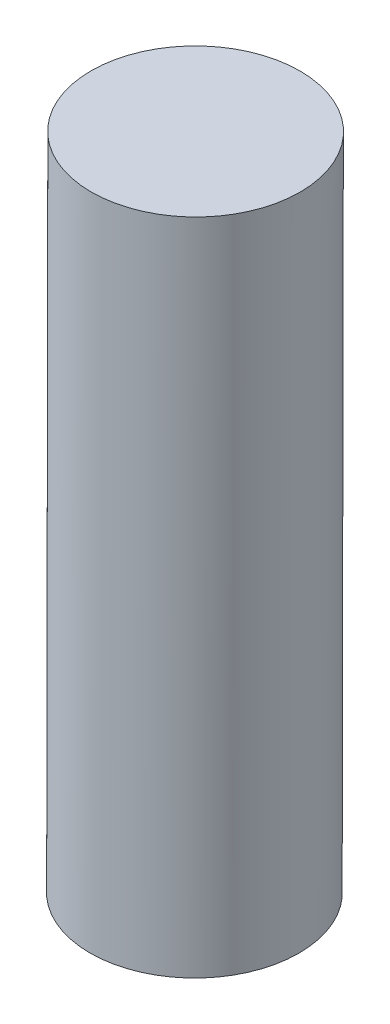
ISO-10303-21;
HEADER;
FILE_DESCRIPTION(('STEP AP214'),'2;1');
FILE_NAME('part.step','',(''),(''),'','','');
FILE_SCHEMA(('AUTOMOTIVE_DESIGN { 1 0 10303 214 1 1 1 1 }'));
ENDSEC;
DATA;
#1=APPLICATION_CONTEXT('core data for automotive mechanical design processes');
#2=APPLICATION_PROTOCOL_DEFINITION('international standard','automotive_design',2000,#1);
#3=PRODUCT_CONTEXT('',#1,'mechanical');
#4=PRODUCT('Part','Part','',(#3));
#5=PRODUCT_RELATED_PRODUCT_CATEGORY('part','',(#4));
#6=PRODUCT_DEFINITION_FORMATION('','',#4);
#7=PRODUCT_DEFINITION_CONTEXT('part definition',#1,'design');
#8=PRODUCT_DEFINITION('design','',#6,#7);
#9=PRODUCT_DEFINITION_SHAPE('','',#8);
#10=(LENGTH_UNIT() NAMED_UNIT(*) SI_UNIT(.MILLI.,.METRE.));
#11=(NAMED_UNIT(*) PLANE_ANGLE_UNIT() SI_UNIT($,.RADIAN.));
#12=(NAMED_UNIT(*) SI_UNIT($,.STERADIAN.) SOLID_ANGLE_UNIT());
#13=UNCERTAINTY_MEASURE_WITH_UNIT(LENGTH_MEASURE(1.E-05),#10,'distance_accuracy_value','');
#14=(GEOMETRIC_REPRESENTATION_CONTEXT(3) GLOBAL_UNCERTAINTY_ASSIGNED_CONTEXT((#13)) GLOBAL_UNIT_ASSIGNED_CONTEXT((#10,
#11,#12)) REPRESENTATION_CONTEXT('',''));
#15=CARTESIAN_POINT('',(0.,0.,0.));
#16=DIRECTION('',(0.,0.,1.));
#17=DIRECTION('',(1.,0.,0.));
#18=AXIS2_PLACEMENT_3D('',#15,#16,#17);
#19=CARTESIAN_POINT('',(-266.61706433789,133.219904817138,163.321796792769));
#20=DIRECTION('',(0.00176421332219243,0.999998443774466,1.17136488108813E-09));
#21=DIRECTION('',(-0.999998443774466,0.00176421332219243,0.));
#22=AXIS2_PLACEMENT_3D('',#19,#20,#21);
#23=PLANE('',#22);
#24=CARTESIAN_POINT('',(-266.61706433789,133.219904817138,163.321796792769));
#25=DIRECTION('',(0.00176421332219243,0.999998443774466,1.17136488108813E-09));
#26=DIRECTION('',(-0.999998443774466,0.00176421332219243,0.));
#27=AXIS2_PLACEMENT_3D('',#24,#25,#26);
#28=CIRCLE('',#27,4.69900000000002);
#29=CARTESIAN_POINT('',(-271.316057025187,133.228194855539,163.321796792769));
#30=VERTEX_POINT('',#29);
#31=EDGE_CURVE('E46',#30,#30,#28,.T.);
#32=ORIENTED_EDGE('',*,*,#31,.F.);
#33=EDGE_LOOP('',(#32));
#34=FACE_BOUND('',#33,.T.);
#35=ADVANCED_FACE('F40',(#34),#23,.F.);
#36=CARTESIAN_POINT('',(-266.564789525206,162.850522994416,163.321796827478));
#37=DIRECTION('',(0.00176421332219243,0.999998443774466,1.17136488108813E-09));
#38=DIRECTION('',(-0.999998443774466,0.00176421332219243,0.));
#39=AXIS2_PLACEMENT_3D('',#36,#37,#38);
#40=PLANE('',#39);
#41=CARTESIAN_POINT('',(-266.564789525206,162.850522994416,163.321796827478));
#42=DIRECTION('',(0.00176421332219243,0.999998443774466,1.17136488108813E-09));
#43=DIRECTION('',(-0.999998443774466,0.00176421332219243,0.));
#44=AXIS2_PLACEMENT_3D('',#41,#42,#43);
#45=CIRCLE('',#44,4.69900000000002);
#46=CARTESIAN_POINT('',(-271.263782212502,162.858813032817,163.321796827478));
#47=VERTEX_POINT('',#46);
#48=EDGE_CURVE('E11',#47,#47,#45,.T.);
#49=ORIENTED_EDGE('',*,*,#48,.T.);
#50=EDGE_LOOP('',(#49));
#51=FACE_BOUND('',#50,.T.);
#52=ADVANCED_FACE('F55',(#51),#40,.T.);
#53=CARTESIAN_POINT('',(-266.61706433789,133.219904817138,163.321796792769));
#54=DIRECTION('',(0.00176421332219243,0.999998443774466,1.17136488108813E-09));
#55=DIRECTION('',(-0.999998443774466,0.00176421332219243,0.));
#56=AXIS2_PLACEMENT_3D('',#53,#54,#55);
#57=CYLINDRICAL_SURFACE('',#56,4.69900000000002);
#58=ORIENTED_EDGE('',*,*,#48,.F.);
#59=EDGE_LOOP('',(#58));
#60=FACE_BOUND('',#59,.T.);
#61=ORIENTED_EDGE('',*,*,#31,.T.);
#62=EDGE_LOOP('',(#61));
#63=FACE_BOUND('',#62,.T.);
#64=ADVANCED_FACE('F52',(#60,#63),#57,.T.);
#65=CLOSED_SHELL('',(#35,#52,#64));
#66=MANIFOLD_SOLID_BREP('B2',#65);
#67=ADVANCED_BREP_SHAPE_REPRESENTATION('',(#18,#66),#14);
#68=SHAPE_DEFINITION_REPRESENTATION(#9,#67);
ENDSEC;
END-ISO-10303-21;
